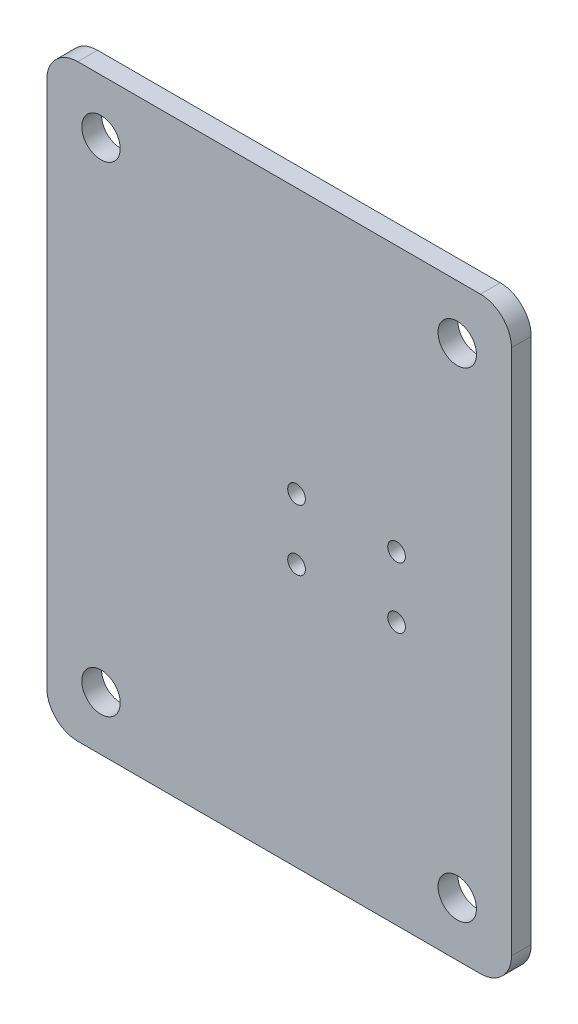
ISO-10303-21;
HEADER;
FILE_DESCRIPTION(('STEP AP214'),'2;1');
FILE_NAME('part.step','',(''),(''),'','','');
FILE_SCHEMA(('AUTOMOTIVE_DESIGN { 1 0 10303 214 1 1 1 1 }'));
ENDSEC;
DATA;
#1=APPLICATION_CONTEXT('core data for automotive mechanical design processes');
#2=APPLICATION_PROTOCOL_DEFINITION('international standard','automotive_design',2000,#1);
#3=PRODUCT_CONTEXT('',#1,'mechanical');
#4=PRODUCT('Part','Part','',(#3));
#5=PRODUCT_RELATED_PRODUCT_CATEGORY('part','',(#4));
#6=PRODUCT_DEFINITION_FORMATION('','',#4);
#7=PRODUCT_DEFINITION_CONTEXT('part definition',#1,'design');
#8=PRODUCT_DEFINITION('design','',#6,#7);
#9=PRODUCT_DEFINITION_SHAPE('','',#8);
#10=(LENGTH_UNIT() NAMED_UNIT(*) SI_UNIT(.MILLI.,.METRE.));
#11=(NAMED_UNIT(*) PLANE_ANGLE_UNIT() SI_UNIT($,.RADIAN.));
#12=(NAMED_UNIT(*) SI_UNIT($,.STERADIAN.) SOLID_ANGLE_UNIT());
#13=UNCERTAINTY_MEASURE_WITH_UNIT(LENGTH_MEASURE(1.E-05),#10,'distance_accuracy_value','');
#14=(GEOMETRIC_REPRESENTATION_CONTEXT(3) GLOBAL_UNCERTAINTY_ASSIGNED_CONTEXT((#13)) GLOBAL_UNIT_ASSIGNED_CONTEXT((#10,
#11,#12)) REPRESENTATION_CONTEXT('',''));
#15=CARTESIAN_POINT('',(0.,0.,0.));
#16=DIRECTION('',(0.,0.,1.));
#17=DIRECTION('',(1.,0.,0.));
#18=AXIS2_PLACEMENT_3D('',#15,#16,#17);
#19=CARTESIAN_POINT('',(447.929,324.993,1.6194));
#20=DIRECTION('',(0.,0.,-1.));
#21=DIRECTION('',(-1.,0.,0.));
#22=AXIS2_PLACEMENT_3D('',#19,#20,#21);
#23=CYLINDRICAL_SURFACE('',#22,2.54000000000001);
#24=CARTESIAN_POINT('',(447.929,324.993,0.));
#25=DIRECTION('',(0.,0.,1.));
#26=DIRECTION('',(-1.,0.,0.));
#27=AXIS2_PLACEMENT_3D('',#24,#25,#26);
#28=CIRCLE('',#27,2.54000000000001);
#29=CARTESIAN_POINT('',(445.389,324.993,0.));
#30=VERTEX_POINT('',#29);
#31=CARTESIAN_POINT('',(447.929,322.453,0.));
#32=VERTEX_POINT('',#31);
#33=EDGE_CURVE('E141',#30,#32,#28,.T.);
#34=ORIENTED_EDGE('',*,*,#33,.T.);
#35=DIRECTION('',(0.,0.,-1.));
#36=VECTOR('',#35,1.);
#37=CARTESIAN_POINT('',(447.929,322.453,1.6194));
#38=LINE('',#37,#36);
#39=CARTESIAN_POINT('',(447.929,322.453,1.6194));
#40=VERTEX_POINT('',#39);
#41=EDGE_CURVE('E11',#40,#32,#38,.T.);
#42=ORIENTED_EDGE('',*,*,#41,.F.);
#43=CARTESIAN_POINT('',(447.929,324.993,1.6194));
#44=DIRECTION('',(0.,0.,1.));
#45=DIRECTION('',(-1.,0.,0.));
#46=AXIS2_PLACEMENT_3D('',#43,#44,#45);
#47=CIRCLE('',#46,2.54000000000001);
#48=CARTESIAN_POINT('',(445.389,324.993,1.6194));
#49=VERTEX_POINT('',#48);
#50=EDGE_CURVE('E156',#49,#40,#47,.T.);
#51=ORIENTED_EDGE('',*,*,#50,.F.);
#52=DIRECTION('',(0.,0.,-1.));
#53=VECTOR('',#52,1.);
#54=CARTESIAN_POINT('',(445.389,324.993,1.6194));
#55=LINE('',#54,#53);
#56=EDGE_CURVE('E137',#49,#30,#55,.T.);
#57=ORIENTED_EDGE('',*,*,#56,.T.);
#58=EDGE_LOOP('',(#34,#42,#51,#57));
#59=FACE_BOUND('',#58,.T.);
#60=ADVANCED_FACE('F45',(#59),#23,.T.);
#61=CARTESIAN_POINT('',(480.949,322.453,1.6194));
#62=DIRECTION('',(0.,1.,0.));
#63=DIRECTION('',(0.,0.,1.));
#64=AXIS2_PLACEMENT_3D('',#61,#62,#63);
#65=PLANE('',#64);
#66=DIRECTION('',(1.,0.,0.));
#67=VECTOR('',#66,1.);
#68=CARTESIAN_POINT('',(480.949,322.453,0.));
#69=LINE('',#68,#67);
#70=CARTESIAN_POINT('',(480.949,322.453,0.));
#71=VERTEX_POINT('',#70);
#72=EDGE_CURVE('E144',#32,#71,#69,.T.);
#73=ORIENTED_EDGE('',*,*,#72,.T.);
#74=DIRECTION('',(0.,0.,-1.));
#75=VECTOR('',#74,1.);
#76=CARTESIAN_POINT('',(480.949,322.453,1.6194));
#77=LINE('',#76,#75);
#78=CARTESIAN_POINT('',(480.949,322.453,1.6194));
#79=VERTEX_POINT('',#78);
#80=EDGE_CURVE('E53',#79,#71,#77,.T.);
#81=ORIENTED_EDGE('',*,*,#80,.F.);
#82=DIRECTION('',(1.,0.,0.));
#83=VECTOR('',#82,1.);
#84=CARTESIAN_POINT('',(480.949,322.453,1.6194));
#85=LINE('',#84,#83);
#86=EDGE_CURVE('E104',#40,#79,#85,.T.);
#87=ORIENTED_EDGE('',*,*,#86,.F.);
#88=ORIENTED_EDGE('',*,*,#41,.T.);
#89=EDGE_LOOP('',(#73,#81,#87,#88));
#90=FACE_BOUND('',#89,.T.);
#91=ADVANCED_FACE('F271',(#90),#65,.F.);
#92=CARTESIAN_POINT('',(480.949,324.993,1.6194));
#93=DIRECTION('',(0.,0.,-1.));
#94=DIRECTION('',(-1.,0.,0.));
#95=AXIS2_PLACEMENT_3D('',#92,#93,#94);
#96=CYLINDRICAL_SURFACE('',#95,2.53999999999999);
#97=CARTESIAN_POINT('',(480.949,324.993,0.));
#98=DIRECTION('',(0.,0.,1.));
#99=DIRECTION('',(-1.,0.,0.));
#100=AXIS2_PLACEMENT_3D('',#97,#98,#99);
#101=CIRCLE('',#100,2.53999999999999);
#102=CARTESIAN_POINT('',(483.489,324.993,0.));
#103=VERTEX_POINT('',#102);
#104=EDGE_CURVE('E147',#71,#103,#101,.T.);
#105=ORIENTED_EDGE('',*,*,#104,.T.);
#106=DIRECTION('',(0.,0.,-1.));
#107=VECTOR('',#106,1.);
#108=CARTESIAN_POINT('',(483.489,324.993,1.6194));
#109=LINE('',#108,#107);
#110=CARTESIAN_POINT('',(483.489,324.993,1.6194));
#111=VERTEX_POINT('',#110);
#112=EDGE_CURVE('E163',#111,#103,#109,.T.);
#113=ORIENTED_EDGE('',*,*,#112,.F.);
#114=CARTESIAN_POINT('',(480.949,324.993,1.6194));
#115=DIRECTION('',(0.,0.,1.));
#116=DIRECTION('',(-1.,0.,0.));
#117=AXIS2_PLACEMENT_3D('',#114,#115,#116);
#118=CIRCLE('',#117,2.53999999999999);
#119=EDGE_CURVE('E171',#79,#111,#118,.T.);
#120=ORIENTED_EDGE('',*,*,#119,.F.);
#121=ORIENTED_EDGE('',*,*,#80,.T.);
#122=EDGE_LOOP('',(#105,#113,#120,#121));
#123=FACE_BOUND('',#122,.T.);
#124=ADVANCED_FACE('F169',(#123),#96,.T.);
#125=CARTESIAN_POINT('',(483.489,368.173,1.6194));
#126=DIRECTION('',(-1.,0.,0.));
#127=DIRECTION('',(0.,0.,1.));
#128=AXIS2_PLACEMENT_3D('',#125,#126,#127);
#129=PLANE('',#128);
#130=DIRECTION('',(0.,1.,0.));
#131=VECTOR('',#130,1.);
#132=CARTESIAN_POINT('',(483.489,368.173,0.));
#133=LINE('',#132,#131);
#134=CARTESIAN_POINT('',(483.489,368.173,0.));
#135=VERTEX_POINT('',#134);
#136=EDGE_CURVE('E149',#103,#135,#133,.T.);
#137=ORIENTED_EDGE('',*,*,#136,.T.);
#138=DIRECTION('',(0.,0.,-1.));
#139=VECTOR('',#138,1.);
#140=CARTESIAN_POINT('',(483.489,368.173,1.6194));
#141=LINE('',#140,#139);
#142=CARTESIAN_POINT('',(483.489,368.173,1.6194));
#143=VERTEX_POINT('',#142);
#144=EDGE_CURVE('E160',#143,#135,#141,.T.);
#145=ORIENTED_EDGE('',*,*,#144,.F.);
#146=DIRECTION('',(0.,1.,0.));
#147=VECTOR('',#146,1.);
#148=CARTESIAN_POINT('',(483.489,368.173,1.6194));
#149=LINE('',#148,#147);
#150=EDGE_CURVE('E183',#111,#143,#149,.T.);
#151=ORIENTED_EDGE('',*,*,#150,.F.);
#152=ORIENTED_EDGE('',*,*,#112,.T.);
#153=EDGE_LOOP('',(#137,#145,#151,#152));
#154=FACE_BOUND('',#153,.T.);
#155=ADVANCED_FACE('F179',(#154),#129,.F.);
#156=CARTESIAN_POINT('',(480.949,368.173,1.6194));
#157=DIRECTION('',(0.,0.,-1.));
#158=DIRECTION('',(-1.,0.,0.));
#159=AXIS2_PLACEMENT_3D('',#156,#157,#158);
#160=CYLINDRICAL_SURFACE('',#159,2.53999999999999);
#161=CARTESIAN_POINT('',(480.949,368.173,0.));
#162=DIRECTION('',(0.,0.,1.));
#163=DIRECTION('',(-1.,0.,0.));
#164=AXIS2_PLACEMENT_3D('',#161,#162,#163);
#165=CIRCLE('',#164,2.53999999999999);
#166=CARTESIAN_POINT('',(480.949,370.713,0.));
#167=VERTEX_POINT('',#166);
#168=EDGE_CURVE('E151',#135,#167,#165,.T.);
#169=ORIENTED_EDGE('',*,*,#168,.T.);
#170=DIRECTION('',(0.,0.,-1.));
#171=VECTOR('',#170,1.);
#172=CARTESIAN_POINT('',(480.949,370.713,1.6194));
#173=LINE('',#172,#171);
#174=CARTESIAN_POINT('',(480.949,370.713,1.6194));
#175=VERTEX_POINT('',#174);
#176=EDGE_CURVE('E132',#175,#167,#173,.T.);
#177=ORIENTED_EDGE('',*,*,#176,.F.);
#178=CARTESIAN_POINT('',(480.949,368.173,1.6194));
#179=DIRECTION('',(0.,0.,1.));
#180=DIRECTION('',(-1.,0.,0.));
#181=AXIS2_PLACEMENT_3D('',#178,#179,#180);
#182=CIRCLE('',#181,2.53999999999999);
#183=EDGE_CURVE('E123',#143,#175,#182,.T.);
#184=ORIENTED_EDGE('',*,*,#183,.F.);
#185=ORIENTED_EDGE('',*,*,#144,.T.);
#186=EDGE_LOOP('',(#169,#177,#184,#185));
#187=FACE_BOUND('',#186,.T.);
#188=ADVANCED_FACE('F182',(#187),#160,.T.);
#189=CARTESIAN_POINT('',(447.929,370.713,1.6194));
#190=DIRECTION('',(0.,-1.,0.));
#191=DIRECTION('',(0.,0.,-1.));
#192=AXIS2_PLACEMENT_3D('',#189,#190,#191);
#193=PLANE('',#192);
#194=DIRECTION('',(-1.,0.,0.));
#195=VECTOR('',#194,1.);
#196=CARTESIAN_POINT('',(447.929,370.713,0.));
#197=LINE('',#196,#195);
#198=CARTESIAN_POINT('',(447.929,370.713,0.));
#199=VERTEX_POINT('',#198);
#200=EDGE_CURVE('E131',#167,#199,#197,.T.);
#201=ORIENTED_EDGE('',*,*,#200,.T.);
#202=DIRECTION('',(0.,0.,-1.));
#203=VECTOR('',#202,1.);
#204=CARTESIAN_POINT('',(447.929,370.713,1.6194));
#205=LINE('',#204,#203);
#206=CARTESIAN_POINT('',(447.929,370.713,1.6194));
#207=VERTEX_POINT('',#206);
#208=EDGE_CURVE('E128',#207,#199,#205,.T.);
#209=ORIENTED_EDGE('',*,*,#208,.F.);
#210=DIRECTION('',(-1.,0.,0.));
#211=VECTOR('',#210,1.);
#212=CARTESIAN_POINT('',(447.929,370.713,1.6194));
#213=LINE('',#212,#211);
#214=EDGE_CURVE('E117',#175,#207,#213,.T.);
#215=ORIENTED_EDGE('',*,*,#214,.F.);
#216=ORIENTED_EDGE('',*,*,#176,.T.);
#217=EDGE_LOOP('',(#201,#209,#215,#216));
#218=FACE_BOUND('',#217,.T.);
#219=ADVANCED_FACE('F129',(#218),#193,.F.);
#220=CARTESIAN_POINT('',(447.929,368.173,1.6194));
#221=DIRECTION('',(0.,0.,-1.));
#222=DIRECTION('',(-1.,0.,0.));
#223=AXIS2_PLACEMENT_3D('',#220,#221,#222);
#224=CYLINDRICAL_SURFACE('',#223,2.54000000000001);
#225=CARTESIAN_POINT('',(447.929,368.173,0.));
#226=DIRECTION('',(0.,0.,1.));
#227=DIRECTION('',(-1.,0.,0.));
#228=AXIS2_PLACEMENT_3D('',#225,#226,#227);
#229=CIRCLE('',#228,2.54000000000001);
#230=CARTESIAN_POINT('',(445.389,368.173,0.));
#231=VERTEX_POINT('',#230);
#232=EDGE_CURVE('E90',#199,#231,#229,.T.);
#233=ORIENTED_EDGE('',*,*,#232,.T.);
#234=DIRECTION('',(0.,0.,-1.));
#235=VECTOR('',#234,1.);
#236=CARTESIAN_POINT('',(445.389,368.173,1.6194));
#237=LINE('',#236,#235);
#238=CARTESIAN_POINT('',(445.389,368.173,1.6194));
#239=VERTEX_POINT('',#238);
#240=EDGE_CURVE('E133',#239,#231,#237,.T.);
#241=ORIENTED_EDGE('',*,*,#240,.F.);
#242=CARTESIAN_POINT('',(447.929,368.173,1.6194));
#243=DIRECTION('',(0.,0.,1.));
#244=DIRECTION('',(-1.,0.,0.));
#245=AXIS2_PLACEMENT_3D('',#242,#243,#244);
#246=CIRCLE('',#245,2.54000000000001);
#247=EDGE_CURVE('E121',#207,#239,#246,.T.);
#248=ORIENTED_EDGE('',*,*,#247,.F.);
#249=ORIENTED_EDGE('',*,*,#208,.T.);
#250=EDGE_LOOP('',(#233,#241,#248,#249));
#251=FACE_BOUND('',#250,.T.);
#252=ADVANCED_FACE('F135',(#251),#224,.T.);
#253=CARTESIAN_POINT('',(445.389,324.993,1.6194));
#254=DIRECTION('',(1.,0.,0.));
#255=DIRECTION('',(0.,0.,-1.));
#256=AXIS2_PLACEMENT_3D('',#253,#254,#255);
#257=PLANE('',#256);
#258=DIRECTION('',(0.,-1.,0.));
#259=VECTOR('',#258,1.);
#260=CARTESIAN_POINT('',(445.389,324.993,0.));
#261=LINE('',#260,#259);
#262=EDGE_CURVE('E96',#231,#30,#261,.T.);
#263=ORIENTED_EDGE('',*,*,#262,.T.);
#264=ORIENTED_EDGE('',*,*,#56,.F.);
#265=DIRECTION('',(0.,-1.,0.));
#266=VECTOR('',#265,1.);
#267=CARTESIAN_POINT('',(445.389,324.993,1.6194));
#268=LINE('',#267,#266);
#269=EDGE_CURVE('E61',#239,#49,#268,.T.);
#270=ORIENTED_EDGE('',*,*,#269,.F.);
#271=ORIENTED_EDGE('',*,*,#240,.T.);
#272=EDGE_LOOP('',(#263,#264,#270,#271));
#273=FACE_BOUND('',#272,.T.);
#274=ADVANCED_FACE('F278',(#273),#257,.F.);
#275=CARTESIAN_POINT('',(447.929,324.993,1.6194));
#276=DIRECTION('',(0.,0.,-1.));
#277=DIRECTION('',(-1.,0.,0.));
#278=AXIS2_PLACEMENT_3D('',#275,#276,#277);
#279=PLANE('',#278);
#280=CARTESIAN_POINT('',(449.834,326.898,1.61939999999999));
#281=DIRECTION('',(0.,0.,-1.));
#282=DIRECTION('',(-1.,0.,0.));
#283=AXIS2_PLACEMENT_3D('',#280,#281,#282);
#284=CIRCLE('',#283,1.57499999999999);
#285=CARTESIAN_POINT('',(448.259,326.898,1.61939999999999));
#286=VERTEX_POINT('',#285);
#287=EDGE_CURVE('E230',#286,#286,#284,.T.);
#288=ORIENTED_EDGE('',*,*,#287,.T.);
#289=EDGE_LOOP('',(#288));
#290=FACE_BOUND('',#289,.T.);
#291=CARTESIAN_POINT('',(449.834,366.268,1.61939999999999));
#292=DIRECTION('',(0.,0.,-1.));
#293=DIRECTION('',(-1.,0.,0.));
#294=AXIS2_PLACEMENT_3D('',#291,#292,#293);
#295=CIRCLE('',#294,1.57499999999999);
#296=CARTESIAN_POINT('',(448.259,366.268,1.61939999999999));
#297=VERTEX_POINT('',#296);
#298=EDGE_CURVE('E224',#297,#297,#295,.T.);
#299=ORIENTED_EDGE('',*,*,#298,.T.);
#300=EDGE_LOOP('',(#299));
#301=FACE_BOUND('',#300,.T.);
#302=CARTESIAN_POINT('',(479.044,366.268,1.61939999999999));
#303=DIRECTION('',(0.,0.,-1.));
#304=DIRECTION('',(-1.,0.,0.));
#305=AXIS2_PLACEMENT_3D('',#302,#303,#304);
#306=CIRCLE('',#305,1.57499999999999);
#307=CARTESIAN_POINT('',(477.469,366.268,1.61939999999999));
#308=VERTEX_POINT('',#307);
#309=EDGE_CURVE('E218',#308,#308,#306,.T.);
#310=ORIENTED_EDGE('',*,*,#309,.T.);
#311=EDGE_LOOP('',(#310));
#312=FACE_BOUND('',#311,.T.);
#313=CARTESIAN_POINT('',(479.044,326.898,1.61939999999999));
#314=DIRECTION('',(0.,0.,-1.));
#315=DIRECTION('',(-1.,0.,0.));
#316=AXIS2_PLACEMENT_3D('',#313,#314,#315);
#317=CIRCLE('',#316,1.57499999999999);
#318=CARTESIAN_POINT('',(477.469,326.898,1.61939999999999));
#319=VERTEX_POINT('',#318);
#320=EDGE_CURVE('E212',#319,#319,#317,.T.);
#321=ORIENTED_EDGE('',*,*,#320,.T.);
#322=EDGE_LOOP('',(#321));
#323=FACE_BOUND('',#322,.T.);
#324=CARTESIAN_POINT('',(465.867,348.983,1.61939999999999));
#325=DIRECTION('',(0.,0.,-1.));
#326=DIRECTION('',(-1.,0.,0.));
#327=AXIS2_PLACEMENT_3D('',#324,#325,#326);
#328=CIRCLE('',#327,0.724999999999976);
#329=CARTESIAN_POINT('',(465.142,348.983,1.61939999999999));
#330=VERTEX_POINT('',#329);
#331=EDGE_CURVE('E206',#330,#330,#328,.T.);
#332=ORIENTED_EDGE('',*,*,#331,.T.);
#333=EDGE_LOOP('',(#332));
#334=FACE_BOUND('',#333,.T.);
#335=CARTESIAN_POINT('',(474.067,348.983,1.61939999999999));
#336=DIRECTION('',(0.,0.,-1.));
#337=DIRECTION('',(-1.,0.,0.));
#338=AXIS2_PLACEMENT_3D('',#335,#336,#337);
#339=CIRCLE('',#338,0.724999999999976);
#340=CARTESIAN_POINT('',(473.342,348.983,1.61939999999999));
#341=VERTEX_POINT('',#340);
#342=EDGE_CURVE('E200',#341,#341,#339,.T.);
#343=ORIENTED_EDGE('',*,*,#342,.T.);
#344=EDGE_LOOP('',(#343));
#345=FACE_BOUND('',#344,.T.);
#346=CARTESIAN_POINT('',(474.067,343.983,1.61939999999999));
#347=DIRECTION('',(0.,0.,-1.));
#348=DIRECTION('',(-1.,0.,0.));
#349=AXIS2_PLACEMENT_3D('',#346,#347,#348);
#350=CIRCLE('',#349,0.724999999999976);
#351=CARTESIAN_POINT('',(473.342,343.983,1.61939999999999));
#352=VERTEX_POINT('',#351);
#353=EDGE_CURVE('E194',#352,#352,#350,.T.);
#354=ORIENTED_EDGE('',*,*,#353,.T.);
#355=EDGE_LOOP('',(#354));
#356=FACE_BOUND('',#355,.T.);
#357=CARTESIAN_POINT('',(465.867,343.983,1.61939999999999));
#358=DIRECTION('',(0.,0.,-1.));
#359=DIRECTION('',(-1.,0.,0.));
#360=AXIS2_PLACEMENT_3D('',#357,#358,#359);
#361=CIRCLE('',#360,0.724999999999976);
#362=CARTESIAN_POINT('',(465.142,343.983,1.61939999999999));
#363=VERTEX_POINT('',#362);
#364=EDGE_CURVE('E145',#363,#363,#361,.T.);
#365=ORIENTED_EDGE('',*,*,#364,.T.);
#366=EDGE_LOOP('',(#365));
#367=FACE_BOUND('',#366,.T.);
#368=ORIENTED_EDGE('',*,*,#50,.T.);
#369=ORIENTED_EDGE('',*,*,#86,.T.);
#370=ORIENTED_EDGE('',*,*,#119,.T.);
#371=ORIENTED_EDGE('',*,*,#150,.T.);
#372=ORIENTED_EDGE('',*,*,#183,.T.);
#373=ORIENTED_EDGE('',*,*,#214,.T.);
#374=ORIENTED_EDGE('',*,*,#247,.T.);
#375=ORIENTED_EDGE('',*,*,#269,.T.);
#376=EDGE_LOOP('',(#368,#369,#370,#371,#372,#373,#374,#375));
#377=FACE_BOUND('',#376,.T.);
#378=ADVANCED_FACE('F119',(#290,#301,#312,#323,#334,#345,#356,#367,#377),#279,.F.);
#379=CARTESIAN_POINT('',(447.929,324.993,0.));
#380=DIRECTION('',(0.,0.,-1.));
#381=DIRECTION('',(-1.,0.,0.));
#382=AXIS2_PLACEMENT_3D('',#379,#380,#381);
#383=PLANE('',#382);
#384=CARTESIAN_POINT('',(449.834,326.898,0.));
#385=DIRECTION('',(0.,0.,-1.));
#386=DIRECTION('',(-1.,0.,0.));
#387=AXIS2_PLACEMENT_3D('',#384,#385,#386);
#388=CIRCLE('',#387,1.57499999999999);
#389=CARTESIAN_POINT('',(448.259,326.898,0.));
#390=VERTEX_POINT('',#389);
#391=EDGE_CURVE('E233',#390,#390,#388,.T.);
#392=ORIENTED_EDGE('',*,*,#391,.F.);
#393=EDGE_LOOP('',(#392));
#394=FACE_BOUND('',#393,.T.);
#395=CARTESIAN_POINT('',(449.834,366.268,0.));
#396=DIRECTION('',(0.,0.,-1.));
#397=DIRECTION('',(-1.,0.,0.));
#398=AXIS2_PLACEMENT_3D('',#395,#396,#397);
#399=CIRCLE('',#398,1.57499999999999);
#400=CARTESIAN_POINT('',(448.259,366.268,0.));
#401=VERTEX_POINT('',#400);
#402=EDGE_CURVE('E227',#401,#401,#399,.T.);
#403=ORIENTED_EDGE('',*,*,#402,.F.);
#404=EDGE_LOOP('',(#403));
#405=FACE_BOUND('',#404,.T.);
#406=CARTESIAN_POINT('',(479.044,366.268,0.));
#407=DIRECTION('',(0.,0.,-1.));
#408=DIRECTION('',(-1.,0.,0.));
#409=AXIS2_PLACEMENT_3D('',#406,#407,#408);
#410=CIRCLE('',#409,1.57499999999999);
#411=CARTESIAN_POINT('',(477.469,366.268,0.));
#412=VERTEX_POINT('',#411);
#413=EDGE_CURVE('E221',#412,#412,#410,.T.);
#414=ORIENTED_EDGE('',*,*,#413,.F.);
#415=EDGE_LOOP('',(#414));
#416=FACE_BOUND('',#415,.T.);
#417=CARTESIAN_POINT('',(479.044,326.898,0.));
#418=DIRECTION('',(0.,0.,-1.));
#419=DIRECTION('',(-1.,0.,0.));
#420=AXIS2_PLACEMENT_3D('',#417,#418,#419);
#421=CIRCLE('',#420,1.57499999999999);
#422=CARTESIAN_POINT('',(477.469,326.898,0.));
#423=VERTEX_POINT('',#422);
#424=EDGE_CURVE('E215',#423,#423,#421,.T.);
#425=ORIENTED_EDGE('',*,*,#424,.F.);
#426=EDGE_LOOP('',(#425));
#427=FACE_BOUND('',#426,.T.);
#428=CARTESIAN_POINT('',(465.867,348.983,0.));
#429=DIRECTION('',(0.,0.,-1.));
#430=DIRECTION('',(-1.,0.,0.));
#431=AXIS2_PLACEMENT_3D('',#428,#429,#430);
#432=CIRCLE('',#431,0.724999999999976);
#433=CARTESIAN_POINT('',(465.142,348.983,0.));
#434=VERTEX_POINT('',#433);
#435=EDGE_CURVE('E209',#434,#434,#432,.T.);
#436=ORIENTED_EDGE('',*,*,#435,.F.);
#437=EDGE_LOOP('',(#436));
#438=FACE_BOUND('',#437,.T.);
#439=CARTESIAN_POINT('',(474.067,348.983,0.));
#440=DIRECTION('',(0.,0.,-1.));
#441=DIRECTION('',(-1.,0.,0.));
#442=AXIS2_PLACEMENT_3D('',#439,#440,#441);
#443=CIRCLE('',#442,0.724999999999976);
#444=CARTESIAN_POINT('',(473.342,348.983,0.));
#445=VERTEX_POINT('',#444);
#446=EDGE_CURVE('E203',#445,#445,#443,.T.);
#447=ORIENTED_EDGE('',*,*,#446,.F.);
#448=EDGE_LOOP('',(#447));
#449=FACE_BOUND('',#448,.T.);
#450=CARTESIAN_POINT('',(474.067,343.983,0.));
#451=DIRECTION('',(0.,0.,-1.));
#452=DIRECTION('',(-1.,0.,0.));
#453=AXIS2_PLACEMENT_3D('',#450,#451,#452);
#454=CIRCLE('',#453,0.724999999999976);
#455=CARTESIAN_POINT('',(473.342,343.983,0.));
#456=VERTEX_POINT('',#455);
#457=EDGE_CURVE('E197',#456,#456,#454,.T.);
#458=ORIENTED_EDGE('',*,*,#457,.F.);
#459=EDGE_LOOP('',(#458));
#460=FACE_BOUND('',#459,.T.);
#461=CARTESIAN_POINT('',(465.867,343.983,0.));
#462=DIRECTION('',(0.,0.,-1.));
#463=DIRECTION('',(-1.,0.,0.));
#464=AXIS2_PLACEMENT_3D('',#461,#462,#463);
#465=CIRCLE('',#464,0.724999999999976);
#466=CARTESIAN_POINT('',(465.142,343.983,0.));
#467=VERTEX_POINT('',#466);
#468=EDGE_CURVE('E191',#467,#467,#465,.T.);
#469=ORIENTED_EDGE('',*,*,#468,.F.);
#470=EDGE_LOOP('',(#469));
#471=FACE_BOUND('',#470,.T.);
#472=ORIENTED_EDGE('',*,*,#33,.F.);
#473=ORIENTED_EDGE('',*,*,#262,.F.);
#474=ORIENTED_EDGE('',*,*,#232,.F.);
#475=ORIENTED_EDGE('',*,*,#200,.F.);
#476=ORIENTED_EDGE('',*,*,#168,.F.);
#477=ORIENTED_EDGE('',*,*,#136,.F.);
#478=ORIENTED_EDGE('',*,*,#104,.F.);
#479=ORIENTED_EDGE('',*,*,#72,.F.);
#480=EDGE_LOOP('',(#472,#473,#474,#475,#476,#477,#478,#479));
#481=FACE_BOUND('',#480,.T.);
#482=ADVANCED_FACE('F175',(#394,#405,#416,#427,#438,#449,#460,#471,#481),#383,.T.);
#483=CARTESIAN_POINT('',(465.867,343.983,0.));
#484=DIRECTION('',(0.,0.,-1.));
#485=DIRECTION('',(-1.,0.,0.));
#486=AXIS2_PLACEMENT_3D('',#483,#484,#485);
#487=CYLINDRICAL_SURFACE('',#486,0.724999999999976);
#488=ORIENTED_EDGE('',*,*,#364,.F.);
#489=EDGE_LOOP('',(#488));
#490=FACE_BOUND('',#489,.T.);
#491=ORIENTED_EDGE('',*,*,#468,.T.);
#492=EDGE_LOOP('',(#491));
#493=FACE_BOUND('',#492,.T.);
#494=ADVANCED_FACE('F241',(#490,#493),#487,.F.);
#495=CARTESIAN_POINT('',(474.067,343.983,0.));
#496=DIRECTION('',(0.,0.,-1.));
#497=DIRECTION('',(-1.,0.,0.));
#498=AXIS2_PLACEMENT_3D('',#495,#496,#497);
#499=CYLINDRICAL_SURFACE('',#498,0.724999999999976);
#500=ORIENTED_EDGE('',*,*,#353,.F.);
#501=EDGE_LOOP('',(#500));
#502=FACE_BOUND('',#501,.T.);
#503=ORIENTED_EDGE('',*,*,#457,.T.);
#504=EDGE_LOOP('',(#503));
#505=FACE_BOUND('',#504,.T.);
#506=ADVANCED_FACE('F258',(#502,#505),#499,.F.);
#507=CARTESIAN_POINT('',(474.067,348.983,0.));
#508=DIRECTION('',(0.,0.,-1.));
#509=DIRECTION('',(-1.,0.,0.));
#510=AXIS2_PLACEMENT_3D('',#507,#508,#509);
#511=CYLINDRICAL_SURFACE('',#510,0.724999999999976);
#512=ORIENTED_EDGE('',*,*,#342,.F.);
#513=EDGE_LOOP('',(#512));
#514=FACE_BOUND('',#513,.T.);
#515=ORIENTED_EDGE('',*,*,#446,.T.);
#516=EDGE_LOOP('',(#515));
#517=FACE_BOUND('',#516,.T.);
#518=ADVANCED_FACE('F265',(#514,#517),#511,.F.);
#519=CARTESIAN_POINT('',(465.867,348.983,0.));
#520=DIRECTION('',(0.,0.,-1.));
#521=DIRECTION('',(-1.,0.,0.));
#522=AXIS2_PLACEMENT_3D('',#519,#520,#521);
#523=CYLINDRICAL_SURFACE('',#522,0.724999999999976);
#524=ORIENTED_EDGE('',*,*,#331,.F.);
#525=EDGE_LOOP('',(#524));
#526=FACE_BOUND('',#525,.T.);
#527=ORIENTED_EDGE('',*,*,#435,.T.);
#528=EDGE_LOOP('',(#527));
#529=FACE_BOUND('',#528,.T.);
#530=ADVANCED_FACE('F356',(#526,#529),#523,.F.);
#531=CARTESIAN_POINT('',(479.044,326.898,0.));
#532=DIRECTION('',(0.,0.,-1.));
#533=DIRECTION('',(-1.,0.,0.));
#534=AXIS2_PLACEMENT_3D('',#531,#532,#533);
#535=CYLINDRICAL_SURFACE('',#534,1.57499999999999);
#536=ORIENTED_EDGE('',*,*,#320,.F.);
#537=EDGE_LOOP('',(#536));
#538=FACE_BOUND('',#537,.T.);
#539=ORIENTED_EDGE('',*,*,#424,.T.);
#540=EDGE_LOOP('',(#539));
#541=FACE_BOUND('',#540,.T.);
#542=ADVANCED_FACE('F366',(#538,#541),#535,.F.);
#543=CARTESIAN_POINT('',(479.044,366.268,0.));
#544=DIRECTION('',(0.,0.,-1.));
#545=DIRECTION('',(-1.,0.,0.));
#546=AXIS2_PLACEMENT_3D('',#543,#544,#545);
#547=CYLINDRICAL_SURFACE('',#546,1.57499999999999);
#548=ORIENTED_EDGE('',*,*,#309,.F.);
#549=EDGE_LOOP('',(#548));
#550=FACE_BOUND('',#549,.T.);
#551=ORIENTED_EDGE('',*,*,#413,.T.);
#552=EDGE_LOOP('',(#551));
#553=FACE_BOUND('',#552,.T.);
#554=ADVANCED_FACE('F376',(#550,#553),#547,.F.);
#555=CARTESIAN_POINT('',(449.834,366.268,0.));
#556=DIRECTION('',(0.,0.,-1.));
#557=DIRECTION('',(-1.,0.,0.));
#558=AXIS2_PLACEMENT_3D('',#555,#556,#557);
#559=CYLINDRICAL_SURFACE('',#558,1.57499999999999);
#560=ORIENTED_EDGE('',*,*,#298,.F.);
#561=EDGE_LOOP('',(#560));
#562=FACE_BOUND('',#561,.T.);
#563=ORIENTED_EDGE('',*,*,#402,.T.);
#564=EDGE_LOOP('',(#563));
#565=FACE_BOUND('',#564,.T.);
#566=ADVANCED_FACE('F386',(#562,#565),#559,.F.);
#567=CARTESIAN_POINT('',(449.834,326.898,0.));
#568=DIRECTION('',(0.,0.,-1.));
#569=DIRECTION('',(-1.,0.,0.));
#570=AXIS2_PLACEMENT_3D('',#567,#568,#569);
#571=CYLINDRICAL_SURFACE('',#570,1.57499999999999);
#572=ORIENTED_EDGE('',*,*,#287,.F.);
#573=EDGE_LOOP('',(#572));
#574=FACE_BOUND('',#573,.T.);
#575=ORIENTED_EDGE('',*,*,#391,.T.);
#576=EDGE_LOOP('',(#575));
#577=FACE_BOUND('',#576,.T.);
#578=ADVANCED_FACE('F237',(#574,#577),#571,.F.);
#579=CLOSED_SHELL('',(#60,#91,#124,#155,#188,#219,#252,#274,#378,#482,#494,#506,#518,#530,#542,
#554,#566,#578));
#580=MANIFOLD_SOLID_BREP('B2',#579);
#581=ADVANCED_BREP_SHAPE_REPRESENTATION('',(#18,#580),#14);
#582=SHAPE_DEFINITION_REPRESENTATION(#9,#581);
ENDSEC;
END-ISO-10303-21;
